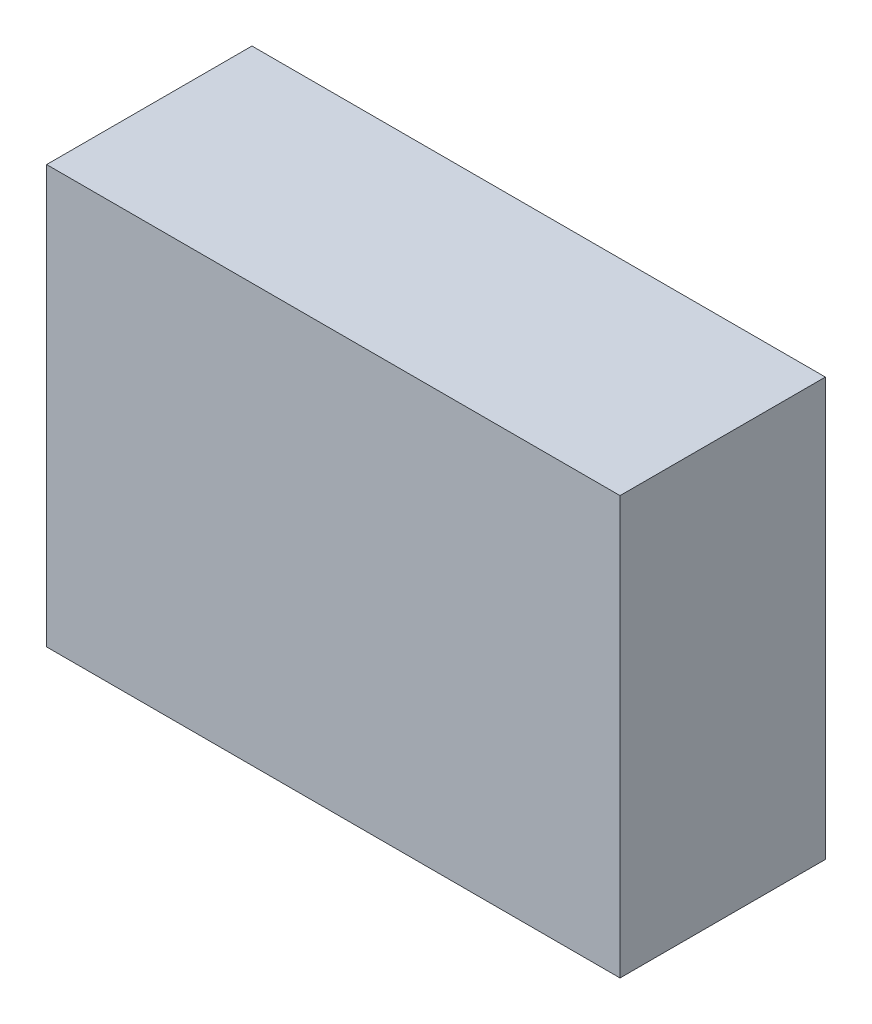
ISO-10303-21;
HEADER;
FILE_DESCRIPTION(('STEP AP214'),'2;1');
FILE_NAME('part.step','',(''),(''),'','','');
FILE_SCHEMA(('AUTOMOTIVE_DESIGN { 1 0 10303 214 1 1 1 1 }'));
ENDSEC;
DATA;
#1=APPLICATION_CONTEXT('core data for automotive mechanical design processes');
#2=APPLICATION_PROTOCOL_DEFINITION('international standard','automotive_design',2000,#1);
#3=PRODUCT_CONTEXT('',#1,'mechanical');
#4=PRODUCT('Part','Part','',(#3));
#5=PRODUCT_RELATED_PRODUCT_CATEGORY('part','',(#4));
#6=PRODUCT_DEFINITION_FORMATION('','',#4);
#7=PRODUCT_DEFINITION_CONTEXT('part definition',#1,'design');
#8=PRODUCT_DEFINITION('design','',#6,#7);
#9=PRODUCT_DEFINITION_SHAPE('','',#8);
#10=(LENGTH_UNIT() NAMED_UNIT(*) SI_UNIT(.MILLI.,.METRE.));
#11=(NAMED_UNIT(*) PLANE_ANGLE_UNIT() SI_UNIT($,.RADIAN.));
#12=(NAMED_UNIT(*) SI_UNIT($,.STERADIAN.) SOLID_ANGLE_UNIT());
#13=UNCERTAINTY_MEASURE_WITH_UNIT(LENGTH_MEASURE(1.E-05),#10,'distance_accuracy_value','');
#14=(GEOMETRIC_REPRESENTATION_CONTEXT(3) GLOBAL_UNCERTAINTY_ASSIGNED_CONTEXT((#13)) GLOBAL_UNIT_ASSIGNED_CONTEXT((#10,
#11,#12)) REPRESENTATION_CONTEXT('',''));
#15=CARTESIAN_POINT('',(0.,0.,0.));
#16=DIRECTION('',(0.,0.,1.));
#17=DIRECTION('',(1.,0.,0.));
#18=AXIS2_PLACEMENT_3D('',#15,#16,#17);
#19=CARTESIAN_POINT('',(10.5,7.65,3.76));
#20=DIRECTION('',(-1.,0.,0.));
#21=DIRECTION('',(0.,0.,1.));
#22=AXIS2_PLACEMENT_3D('',#19,#20,#21);
#23=PLANE('',#22);
#24=DIRECTION('',(0.,1.,0.));
#25=VECTOR('',#24,1.);
#26=CARTESIAN_POINT('',(10.5,7.65,-3.76));
#27=LINE('',#26,#25);
#28=CARTESIAN_POINT('',(10.5,-7.65,-3.76));
#29=VERTEX_POINT('',#28);
#30=CARTESIAN_POINT('',(10.5,7.65,-3.76));
#31=VERTEX_POINT('',#30);
#32=EDGE_CURVE('E99',#29,#31,#27,.T.);
#33=ORIENTED_EDGE('',*,*,#32,.T.);
#34=DIRECTION('',(0.,0.,-1.));
#35=VECTOR('',#34,1.);
#36=CARTESIAN_POINT('',(10.5,7.65,3.76));
#37=LINE('',#36,#35);
#38=CARTESIAN_POINT('',(10.5,7.65,3.76));
#39=VERTEX_POINT('',#38);
#40=EDGE_CURVE('E11',#39,#31,#37,.T.);
#41=ORIENTED_EDGE('',*,*,#40,.F.);
#42=DIRECTION('',(0.,1.,0.));
#43=VECTOR('',#42,1.);
#44=CARTESIAN_POINT('',(10.5,7.65,3.76));
#45=LINE('',#44,#43);
#46=CARTESIAN_POINT('',(10.5,-7.65,3.76));
#47=VERTEX_POINT('',#46);
#48=EDGE_CURVE('E87',#47,#39,#45,.T.);
#49=ORIENTED_EDGE('',*,*,#48,.F.);
#50=DIRECTION('',(0.,0.,-1.));
#51=VECTOR('',#50,1.);
#52=CARTESIAN_POINT('',(10.5,-7.65,3.76));
#53=LINE('',#52,#51);
#54=EDGE_CURVE('E95',#47,#29,#53,.T.);
#55=ORIENTED_EDGE('',*,*,#54,.T.);
#56=EDGE_LOOP('',(#33,#41,#49,#55));
#57=FACE_BOUND('',#56,.T.);
#58=ADVANCED_FACE('F36',(#57),#23,.F.);
#59=CARTESIAN_POINT('',(-10.5,7.65,3.76));
#60=DIRECTION('',(0.,-1.,0.));
#61=DIRECTION('',(0.,0.,-1.));
#62=AXIS2_PLACEMENT_3D('',#59,#60,#61);
#63=PLANE('',#62);
#64=DIRECTION('',(-1.,0.,0.));
#65=VECTOR('',#64,1.);
#66=CARTESIAN_POINT('',(-10.5,7.65,-3.76));
#67=LINE('',#66,#65);
#68=CARTESIAN_POINT('',(-10.5,7.65,-3.76));
#69=VERTEX_POINT('',#68);
#70=EDGE_CURVE('E91',#31,#69,#67,.T.);
#71=ORIENTED_EDGE('',*,*,#70,.T.);
#72=DIRECTION('',(0.,0.,-1.));
#73=VECTOR('',#72,1.);
#74=CARTESIAN_POINT('',(-10.5,7.65,3.76));
#75=LINE('',#74,#73);
#76=CARTESIAN_POINT('',(-10.5,7.65,3.76));
#77=VERTEX_POINT('',#76);
#78=EDGE_CURVE('E44',#77,#69,#75,.T.);
#79=ORIENTED_EDGE('',*,*,#78,.F.);
#80=DIRECTION('',(-1.,0.,0.));
#81=VECTOR('',#80,1.);
#82=CARTESIAN_POINT('',(-10.5,7.65,3.76));
#83=LINE('',#82,#81);
#84=EDGE_CURVE('E82',#39,#77,#83,.T.);
#85=ORIENTED_EDGE('',*,*,#84,.F.);
#86=ORIENTED_EDGE('',*,*,#40,.T.);
#87=EDGE_LOOP('',(#71,#79,#85,#86));
#88=FACE_BOUND('',#87,.T.);
#89=ADVANCED_FACE('F90',(#88),#63,.F.);
#90=CARTESIAN_POINT('',(-10.5,7.65,3.76));
#91=DIRECTION('',(1.,0.,0.));
#92=DIRECTION('',(0.,1.,0.));
#93=AXIS2_PLACEMENT_3D('',#90,#91,#92);
#94=PLANE('',#93);
#95=DIRECTION('',(0.,-1.,0.));
#96=VECTOR('',#95,1.);
#97=CARTESIAN_POINT('',(-10.5,7.65,-3.76));
#98=LINE('',#97,#96);
#99=CARTESIAN_POINT('',(-10.5,-7.65,-3.76));
#100=VERTEX_POINT('',#99);
#101=EDGE_CURVE('E69',#69,#100,#98,.T.);
#102=ORIENTED_EDGE('',*,*,#101,.T.);
#103=DIRECTION('',(0.,0.,-1.));
#104=VECTOR('',#103,1.);
#105=CARTESIAN_POINT('',(-10.5,-7.65,3.76));
#106=LINE('',#105,#104);
#107=CARTESIAN_POINT('',(-10.5,-7.65,3.76));
#108=VERTEX_POINT('',#107);
#109=EDGE_CURVE('E92',#108,#100,#106,.T.);
#110=ORIENTED_EDGE('',*,*,#109,.F.);
#111=DIRECTION('',(0.,-1.,0.));
#112=VECTOR('',#111,1.);
#113=CARTESIAN_POINT('',(-10.5,7.65,3.76));
#114=LINE('',#113,#112);
#115=EDGE_CURVE('E85',#77,#108,#114,.T.);
#116=ORIENTED_EDGE('',*,*,#115,.F.);
#117=ORIENTED_EDGE('',*,*,#78,.T.);
#118=EDGE_LOOP('',(#102,#110,#116,#117));
#119=FACE_BOUND('',#118,.T.);
#120=ADVANCED_FACE('F93',(#119),#94,.F.);
#121=CARTESIAN_POINT('',(-10.5,-7.65,3.76));
#122=DIRECTION('',(0.,1.,0.));
#123=DIRECTION('',(0.,0.,1.));
#124=AXIS2_PLACEMENT_3D('',#121,#122,#123);
#125=PLANE('',#124);
#126=DIRECTION('',(1.,0.,0.));
#127=VECTOR('',#126,1.);
#128=CARTESIAN_POINT('',(-10.5,-7.65,-3.76));
#129=LINE('',#128,#127);
#130=EDGE_CURVE('E75',#100,#29,#129,.T.);
#131=ORIENTED_EDGE('',*,*,#130,.T.);
#132=ORIENTED_EDGE('',*,*,#54,.F.);
#133=DIRECTION('',(1.,0.,0.));
#134=VECTOR('',#133,1.);
#135=CARTESIAN_POINT('',(-10.5,-7.65,3.76));
#136=LINE('',#135,#134);
#137=EDGE_CURVE('E52',#108,#47,#136,.T.);
#138=ORIENTED_EDGE('',*,*,#137,.F.);
#139=ORIENTED_EDGE('',*,*,#109,.T.);
#140=EDGE_LOOP('',(#131,#132,#138,#139));
#141=FACE_BOUND('',#140,.T.);
#142=ADVANCED_FACE('F106',(#141),#125,.F.);
#143=CARTESIAN_POINT('',(0.,0.,3.76));
#144=DIRECTION('',(0.,0.,1.));
#145=DIRECTION('',(1.,0.,0.));
#146=AXIS2_PLACEMENT_3D('',#143,#144,#145);
#147=PLANE('',#146);
#148=ORIENTED_EDGE('',*,*,#48,.T.);
#149=ORIENTED_EDGE('',*,*,#84,.T.);
#150=ORIENTED_EDGE('',*,*,#115,.T.);
#151=ORIENTED_EDGE('',*,*,#137,.T.);
#152=EDGE_LOOP('',(#148,#149,#150,#151));
#153=FACE_BOUND('',#152,.T.);
#154=ADVANCED_FACE('F83',(#153),#147,.T.);
#155=CARTESIAN_POINT('',(0.,0.,-3.76));
#156=DIRECTION('',(0.,0.,1.));
#157=DIRECTION('',(1.,0.,0.));
#158=AXIS2_PLACEMENT_3D('',#155,#156,#157);
#159=PLANE('',#158);
#160=ORIENTED_EDGE('',*,*,#32,.F.);
#161=ORIENTED_EDGE('',*,*,#130,.F.);
#162=ORIENTED_EDGE('',*,*,#101,.F.);
#163=ORIENTED_EDGE('',*,*,#70,.F.);
#164=EDGE_LOOP('',(#160,#161,#162,#163));
#165=FACE_BOUND('',#164,.T.);
#166=ADVANCED_FACE('F109',(#165),#159,.F.);
#167=CLOSED_SHELL('',(#58,#89,#120,#142,#154,#166));
#168=MANIFOLD_SOLID_BREP('B2',#167);
#169=ADVANCED_BREP_SHAPE_REPRESENTATION('',(#18,#168),#14);
#170=SHAPE_DEFINITION_REPRESENTATION(#9,#169);
ENDSEC;
END-ISO-10303-21;
